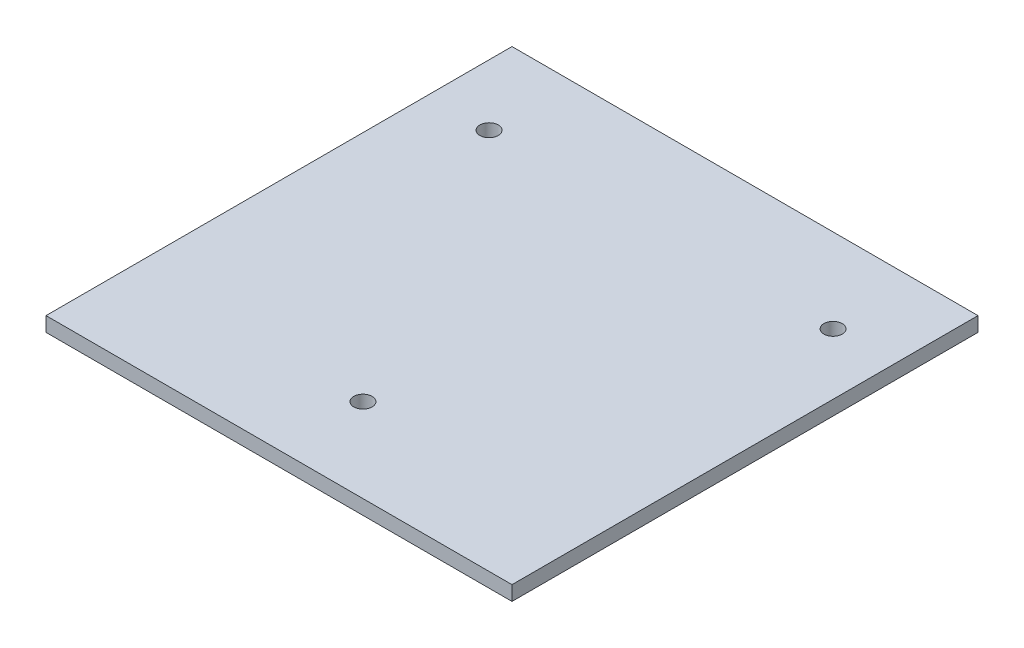
ISO-10303-21;
HEADER;
FILE_DESCRIPTION(('STEP AP214'),'2;1');
FILE_NAME('part.step','',(''),(''),'','','');
FILE_SCHEMA(('AUTOMOTIVE_DESIGN { 1 0 10303 214 1 1 1 1 }'));
ENDSEC;
DATA;
#1=APPLICATION_CONTEXT('core data for automotive mechanical design processes');
#2=APPLICATION_PROTOCOL_DEFINITION('international standard','automotive_design',2000,#1);
#3=PRODUCT_CONTEXT('',#1,'mechanical');
#4=PRODUCT('Part','Part','',(#3));
#5=PRODUCT_RELATED_PRODUCT_CATEGORY('part','',(#4));
#6=PRODUCT_DEFINITION_FORMATION('','',#4);
#7=PRODUCT_DEFINITION_CONTEXT('part definition',#1,'design');
#8=PRODUCT_DEFINITION('design','',#6,#7);
#9=PRODUCT_DEFINITION_SHAPE('','',#8);
#10=(LENGTH_UNIT() NAMED_UNIT(*) SI_UNIT(.MILLI.,.METRE.));
#11=(NAMED_UNIT(*) PLANE_ANGLE_UNIT() SI_UNIT($,.RADIAN.));
#12=(NAMED_UNIT(*) SI_UNIT($,.STERADIAN.) SOLID_ANGLE_UNIT());
#13=UNCERTAINTY_MEASURE_WITH_UNIT(LENGTH_MEASURE(1.E-05),#10,'distance_accuracy_value','');
#14=(GEOMETRIC_REPRESENTATION_CONTEXT(3) GLOBAL_UNCERTAINTY_ASSIGNED_CONTEXT((#13)) GLOBAL_UNIT_ASSIGNED_CONTEXT((#10,
#11,#12)) REPRESENTATION_CONTEXT('',''));
#15=CARTESIAN_POINT('',(0.,0.,0.));
#16=DIRECTION('',(0.,0.,1.));
#17=DIRECTION('',(1.,0.,0.));
#18=AXIS2_PLACEMENT_3D('',#15,#16,#17);
#19=CARTESIAN_POINT('',(101.6,6.35,101.6));
#20=DIRECTION('',(-1.,0.,0.));
#21=DIRECTION('',(0.,0.,1.));
#22=AXIS2_PLACEMENT_3D('',#19,#20,#21);
#23=PLANE('',#22);
#24=DIRECTION('',(0.,0.,-1.));
#25=VECTOR('',#24,1.);
#26=CARTESIAN_POINT('',(101.6,0.,101.6));
#27=LINE('',#26,#25);
#28=CARTESIAN_POINT('',(101.6,0.,101.6));
#29=VERTEX_POINT('',#28);
#30=CARTESIAN_POINT('',(101.6,0.,-101.6));
#31=VERTEX_POINT('',#30);
#32=EDGE_CURVE('E107',#29,#31,#27,.T.);
#33=ORIENTED_EDGE('',*,*,#32,.T.);
#34=DIRECTION('',(0.,-1.,0.));
#35=VECTOR('',#34,1.);
#36=CARTESIAN_POINT('',(101.6,6.35,-101.6));
#37=LINE('',#36,#35);
#38=CARTESIAN_POINT('',(101.6,6.35,-101.6));
#39=VERTEX_POINT('',#38);
#40=EDGE_CURVE('E11',#39,#31,#37,.T.);
#41=ORIENTED_EDGE('',*,*,#40,.F.);
#42=DIRECTION('',(0.,0.,-1.));
#43=VECTOR('',#42,1.);
#44=CARTESIAN_POINT('',(101.6,6.35,101.6));
#45=LINE('',#44,#43);
#46=CARTESIAN_POINT('',(101.6,6.35,101.6));
#47=VERTEX_POINT('',#46);
#48=EDGE_CURVE('E91',#47,#39,#45,.T.);
#49=ORIENTED_EDGE('',*,*,#48,.F.);
#50=DIRECTION('',(0.,-1.,0.));
#51=VECTOR('',#50,1.);
#52=CARTESIAN_POINT('',(101.6,6.35,101.6));
#53=LINE('',#52,#51);
#54=EDGE_CURVE('E103',#47,#29,#53,.T.);
#55=ORIENTED_EDGE('',*,*,#54,.T.);
#56=EDGE_LOOP('',(#33,#41,#49,#55));
#57=FACE_BOUND('',#56,.T.);
#58=ADVANCED_FACE('F39',(#57),#23,.F.);
#59=CARTESIAN_POINT('',(-101.6,6.35,-101.6));
#60=DIRECTION('',(0.,0.,1.));
#61=DIRECTION('',(1.,0.,0.));
#62=AXIS2_PLACEMENT_3D('',#59,#60,#61);
#63=PLANE('',#62);
#64=DIRECTION('',(-1.,0.,0.));
#65=VECTOR('',#64,1.);
#66=CARTESIAN_POINT('',(-101.6,0.,-101.6));
#67=LINE('',#66,#65);
#68=CARTESIAN_POINT('',(-101.6,0.,-101.6));
#69=VERTEX_POINT('',#68);
#70=EDGE_CURVE('E96',#31,#69,#67,.T.);
#71=ORIENTED_EDGE('',*,*,#70,.T.);
#72=DIRECTION('',(0.,-1.,0.));
#73=VECTOR('',#72,1.);
#74=CARTESIAN_POINT('',(-101.6,6.35,-101.6));
#75=LINE('',#74,#73);
#76=CARTESIAN_POINT('',(-101.6,6.35,-101.6));
#77=VERTEX_POINT('',#76);
#78=EDGE_CURVE('E48',#77,#69,#75,.T.);
#79=ORIENTED_EDGE('',*,*,#78,.F.);
#80=DIRECTION('',(-1.,0.,0.));
#81=VECTOR('',#80,1.);
#82=CARTESIAN_POINT('',(-101.6,6.35,-101.6));
#83=LINE('',#82,#81);
#84=EDGE_CURVE('E86',#39,#77,#83,.T.);
#85=ORIENTED_EDGE('',*,*,#84,.F.);
#86=ORIENTED_EDGE('',*,*,#40,.T.);
#87=EDGE_LOOP('',(#71,#79,#85,#86));
#88=FACE_BOUND('',#87,.T.);
#89=ADVANCED_FACE('F95',(#88),#63,.F.);
#90=CARTESIAN_POINT('',(-101.6,6.35,101.6));
#91=DIRECTION('',(1.,0.,0.));
#92=DIRECTION('',(0.,0.,-1.));
#93=AXIS2_PLACEMENT_3D('',#90,#91,#92);
#94=PLANE('',#93);
#95=DIRECTION('',(0.,0.,1.));
#96=VECTOR('',#95,1.);
#97=CARTESIAN_POINT('',(-101.6,0.,101.6));
#98=LINE('',#97,#96);
#99=CARTESIAN_POINT('',(-101.6,0.,101.6));
#100=VERTEX_POINT('',#99);
#101=EDGE_CURVE('E73',#69,#100,#98,.T.);
#102=ORIENTED_EDGE('',*,*,#101,.T.);
#103=DIRECTION('',(0.,-1.,0.));
#104=VECTOR('',#103,1.);
#105=CARTESIAN_POINT('',(-101.6,6.35,101.6));
#106=LINE('',#105,#104);
#107=CARTESIAN_POINT('',(-101.6,6.35,101.6));
#108=VERTEX_POINT('',#107);
#109=EDGE_CURVE('E98',#108,#100,#106,.T.);
#110=ORIENTED_EDGE('',*,*,#109,.F.);
#111=DIRECTION('',(0.,0.,1.));
#112=VECTOR('',#111,1.);
#113=CARTESIAN_POINT('',(-101.6,6.35,101.6));
#114=LINE('',#113,#112);
#115=EDGE_CURVE('E89',#77,#108,#114,.T.);
#116=ORIENTED_EDGE('',*,*,#115,.F.);
#117=ORIENTED_EDGE('',*,*,#78,.T.);
#118=EDGE_LOOP('',(#102,#110,#116,#117));
#119=FACE_BOUND('',#118,.T.);
#120=ADVANCED_FACE('F99',(#119),#94,.F.);
#121=CARTESIAN_POINT('',(-101.6,6.35,101.6));
#122=DIRECTION('',(0.,0.,-1.));
#123=DIRECTION('',(-1.,0.,0.));
#124=AXIS2_PLACEMENT_3D('',#121,#122,#123);
#125=PLANE('',#124);
#126=DIRECTION('',(1.,0.,0.));
#127=VECTOR('',#126,1.);
#128=CARTESIAN_POINT('',(-101.6,0.,101.6));
#129=LINE('',#128,#127);
#130=EDGE_CURVE('E79',#100,#29,#129,.T.);
#131=ORIENTED_EDGE('',*,*,#130,.T.);
#132=ORIENTED_EDGE('',*,*,#54,.F.);
#133=DIRECTION('',(1.,0.,0.));
#134=VECTOR('',#133,1.);
#135=CARTESIAN_POINT('',(-101.6,6.35,101.6));
#136=LINE('',#135,#134);
#137=EDGE_CURVE('E56',#108,#47,#136,.T.);
#138=ORIENTED_EDGE('',*,*,#137,.F.);
#139=ORIENTED_EDGE('',*,*,#109,.T.);
#140=EDGE_LOOP('',(#131,#132,#138,#139));
#141=FACE_BOUND('',#140,.T.);
#142=ADVANCED_FACE('F121',(#141),#125,.F.);
#143=CARTESIAN_POINT('',(0.,6.35,0.));
#144=DIRECTION('',(0.,-1.,0.));
#145=DIRECTION('',(0.,0.,-1.));
#146=AXIS2_PLACEMENT_3D('',#143,#144,#145);
#147=PLANE('',#146);
#148=CARTESIAN_POINT('',(-75.,6.35,-65.));
#149=DIRECTION('',(0.,1.,0.));
#150=DIRECTION('',(0.,0.,1.));
#151=AXIS2_PLACEMENT_3D('',#148,#149,#150);
#152=CIRCLE('',#151,3.99999999999999);
#153=CARTESIAN_POINT('',(-75.,6.35,-61.));
#154=VERTEX_POINT('',#153);
#155=EDGE_CURVE('E144',#154,#154,#152,.T.);
#156=ORIENTED_EDGE('',*,*,#155,.F.);
#157=EDGE_LOOP('',(#156));
#158=FACE_BOUND('',#157,.T.);
#159=CARTESIAN_POINT('',(75.,6.35,-65.));
#160=DIRECTION('',(0.,1.,0.));
#161=DIRECTION('',(0.,0.,1.));
#162=AXIS2_PLACEMENT_3D('',#159,#160,#161);
#163=CIRCLE('',#162,3.99999999999999);
#164=CARTESIAN_POINT('',(75.,6.35,-61.));
#165=VERTEX_POINT('',#164);
#166=EDGE_CURVE('E136',#165,#165,#163,.T.);
#167=ORIENTED_EDGE('',*,*,#166,.F.);
#168=EDGE_LOOP('',(#167));
#169=FACE_BOUND('',#168,.T.);
#170=CARTESIAN_POINT('',(0.,6.35,65.));
#171=DIRECTION('',(0.,1.,0.));
#172=DIRECTION('',(0.,0.,1.));
#173=AXIS2_PLACEMENT_3D('',#170,#171,#172);
#174=CIRCLE('',#173,4.);
#175=CARTESIAN_POINT('',(0.,6.35,69.));
#176=VERTEX_POINT('',#175);
#177=EDGE_CURVE('E128',#176,#176,#174,.T.);
#178=ORIENTED_EDGE('',*,*,#177,.F.);
#179=EDGE_LOOP('',(#178));
#180=FACE_BOUND('',#179,.T.);
#181=ORIENTED_EDGE('',*,*,#48,.T.);
#182=ORIENTED_EDGE('',*,*,#84,.T.);
#183=ORIENTED_EDGE('',*,*,#115,.T.);
#184=ORIENTED_EDGE('',*,*,#137,.T.);
#185=EDGE_LOOP('',(#181,#182,#183,#184));
#186=FACE_BOUND('',#185,.T.);
#187=ADVANCED_FACE('F87',(#158,#169,#180,#186),#147,.F.);
#188=CARTESIAN_POINT('',(0.,0.,0.));
#189=DIRECTION('',(0.,-1.,0.));
#190=DIRECTION('',(0.,0.,-1.));
#191=AXIS2_PLACEMENT_3D('',#188,#189,#190);
#192=PLANE('',#191);
#193=CARTESIAN_POINT('',(-75.,0.,-65.));
#194=DIRECTION('',(0.,1.,0.));
#195=DIRECTION('',(0.,0.,1.));
#196=AXIS2_PLACEMENT_3D('',#193,#194,#195);
#197=CIRCLE('',#196,3.99999999999999);
#198=CARTESIAN_POINT('',(-75.,0.,-61.));
#199=VERTEX_POINT('',#198);
#200=EDGE_CURVE('E111',#199,#199,#197,.T.);
#201=ORIENTED_EDGE('',*,*,#200,.T.);
#202=EDGE_LOOP('',(#201));
#203=FACE_BOUND('',#202,.T.);
#204=CARTESIAN_POINT('',(75.,0.,-65.));
#205=DIRECTION('',(0.,1.,0.));
#206=DIRECTION('',(0.,0.,1.));
#207=AXIS2_PLACEMENT_3D('',#204,#205,#206);
#208=CIRCLE('',#207,3.99999999999999);
#209=CARTESIAN_POINT('',(75.,0.,-61.));
#210=VERTEX_POINT('',#209);
#211=EDGE_CURVE('E140',#210,#210,#208,.T.);
#212=ORIENTED_EDGE('',*,*,#211,.T.);
#213=EDGE_LOOP('',(#212));
#214=FACE_BOUND('',#213,.T.);
#215=CARTESIAN_POINT('',(0.,0.,65.));
#216=DIRECTION('',(0.,1.,0.));
#217=DIRECTION('',(0.,0.,1.));
#218=AXIS2_PLACEMENT_3D('',#215,#216,#217);
#219=CIRCLE('',#218,4.);
#220=CARTESIAN_POINT('',(0.,0.,69.));
#221=VERTEX_POINT('',#220);
#222=EDGE_CURVE('E132',#221,#221,#219,.T.);
#223=ORIENTED_EDGE('',*,*,#222,.T.);
#224=EDGE_LOOP('',(#223));
#225=FACE_BOUND('',#224,.T.);
#226=ORIENTED_EDGE('',*,*,#32,.F.);
#227=ORIENTED_EDGE('',*,*,#130,.F.);
#228=ORIENTED_EDGE('',*,*,#101,.F.);
#229=ORIENTED_EDGE('',*,*,#70,.F.);
#230=EDGE_LOOP('',(#226,#227,#228,#229));
#231=FACE_BOUND('',#230,.T.);
#232=ADVANCED_FACE('F124',(#203,#214,#225,#231),#192,.T.);
#233=CARTESIAN_POINT('',(0.,0.,65.));
#234=DIRECTION('',(0.,1.,0.));
#235=DIRECTION('',(0.,0.,1.));
#236=AXIS2_PLACEMENT_3D('',#233,#234,#235);
#237=CYLINDRICAL_SURFACE('',#236,4.);
#238=ORIENTED_EDGE('',*,*,#222,.F.);
#239=EDGE_LOOP('',(#238));
#240=FACE_BOUND('',#239,.T.);
#241=ORIENTED_EDGE('',*,*,#177,.T.);
#242=EDGE_LOOP('',(#241));
#243=FACE_BOUND('',#242,.T.);
#244=ADVANCED_FACE('F168',(#240,#243),#237,.F.);
#245=CARTESIAN_POINT('',(75.,0.,-65.));
#246=DIRECTION('',(0.,1.,0.));
#247=DIRECTION('',(0.,0.,1.));
#248=AXIS2_PLACEMENT_3D('',#245,#246,#247);
#249=CYLINDRICAL_SURFACE('',#248,3.99999999999999);
#250=ORIENTED_EDGE('',*,*,#211,.F.);
#251=EDGE_LOOP('',(#250));
#252=FACE_BOUND('',#251,.T.);
#253=ORIENTED_EDGE('',*,*,#166,.T.);
#254=EDGE_LOOP('',(#253));
#255=FACE_BOUND('',#254,.T.);
#256=ADVANCED_FACE('F157',(#252,#255),#249,.F.);
#257=CARTESIAN_POINT('',(-75.,0.,-65.));
#258=DIRECTION('',(0.,1.,0.));
#259=DIRECTION('',(0.,0.,1.));
#260=AXIS2_PLACEMENT_3D('',#257,#258,#259);
#261=CYLINDRICAL_SURFACE('',#260,3.99999999999999);
#262=ORIENTED_EDGE('',*,*,#200,.F.);
#263=EDGE_LOOP('',(#262));
#264=FACE_BOUND('',#263,.T.);
#265=ORIENTED_EDGE('',*,*,#155,.T.);
#266=EDGE_LOOP('',(#265));
#267=FACE_BOUND('',#266,.T.);
#268=ADVANCED_FACE('F154',(#264,#267),#261,.F.);
#269=CLOSED_SHELL('',(#58,#89,#120,#142,#187,#232,#244,#256,#268));
#270=MANIFOLD_SOLID_BREP('B2',#269);
#271=ADVANCED_BREP_SHAPE_REPRESENTATION('',(#18,#270),#14);
#272=SHAPE_DEFINITION_REPRESENTATION(#9,#271);
ENDSEC;
END-ISO-10303-21;
